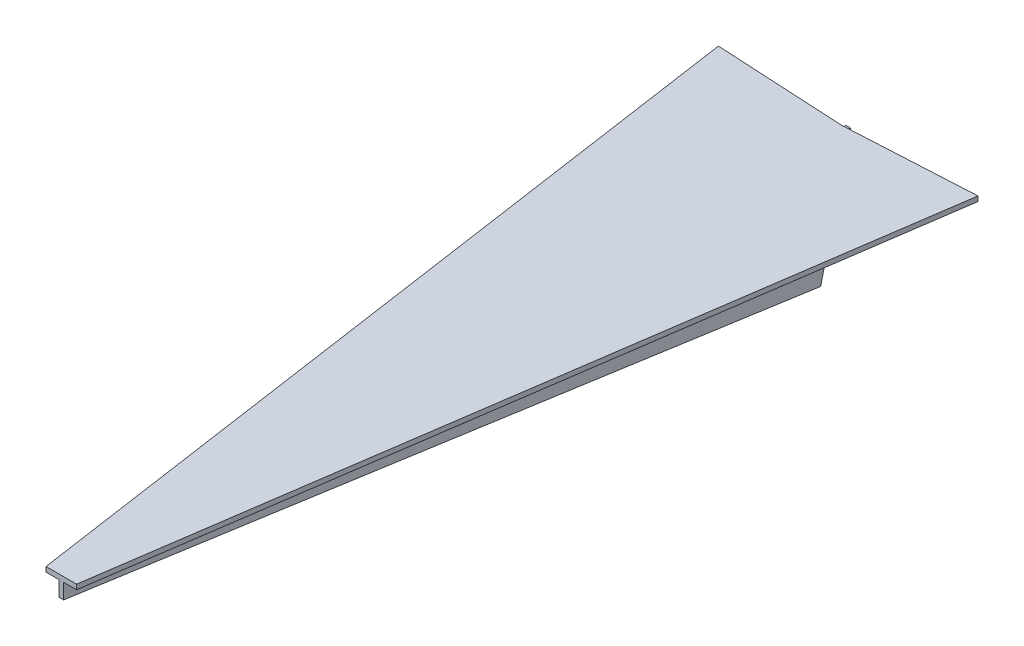
ISO-10303-21;
HEADER;
FILE_DESCRIPTION(('STEP AP214'),'2;1');
FILE_NAME('part.step','',(''),(''),'','','');
FILE_SCHEMA(('AUTOMOTIVE_DESIGN { 1 0 10303 214 1 1 1 1 }'));
ENDSEC;
DATA;
#1=APPLICATION_CONTEXT('core data for automotive mechanical design processes');
#2=APPLICATION_PROTOCOL_DEFINITION('international standard','automotive_design',2000,#1);
#3=PRODUCT_CONTEXT('',#1,'mechanical');
#4=PRODUCT('Part','Part','',(#3));
#5=PRODUCT_RELATED_PRODUCT_CATEGORY('part','',(#4));
#6=PRODUCT_DEFINITION_FORMATION('','',#4);
#7=PRODUCT_DEFINITION_CONTEXT('part definition',#1,'design');
#8=PRODUCT_DEFINITION('design','',#6,#7);
#9=PRODUCT_DEFINITION_SHAPE('','',#8);
#10=(LENGTH_UNIT() NAMED_UNIT(*) SI_UNIT(.MILLI.,.METRE.));
#11=(NAMED_UNIT(*) PLANE_ANGLE_UNIT() SI_UNIT($,.RADIAN.));
#12=(NAMED_UNIT(*) SI_UNIT($,.STERADIAN.) SOLID_ANGLE_UNIT());
#13=UNCERTAINTY_MEASURE_WITH_UNIT(LENGTH_MEASURE(1.E-05),#10,'distance_accuracy_value','');
#14=(GEOMETRIC_REPRESENTATION_CONTEXT(3) GLOBAL_UNCERTAINTY_ASSIGNED_CONTEXT((#13)) GLOBAL_UNIT_ASSIGNED_CONTEXT((#10,
#11,#12)) REPRESENTATION_CONTEXT('',''));
#15=CARTESIAN_POINT('',(0.,0.,0.));
#16=DIRECTION('',(0.,0.,1.));
#17=DIRECTION('',(1.,0.,0.));
#18=AXIS2_PLACEMENT_3D('',#15,#16,#17);
#19=CARTESIAN_POINT('',(0.,0.,0.));
#20=DIRECTION('',(0.,1.,0.));
#21=DIRECTION('',(0.,0.,1.));
#22=AXIS2_PLACEMENT_3D('',#19,#20,#21);
#23=PLANE('',#22);
#24=DIRECTION('',(0.,0.,1.));
#25=VECTOR('',#24,1.);
#26=CARTESIAN_POINT('',(0.75,0.,0.));
#27=LINE('',#26,#25);
#28=CARTESIAN_POINT('',(0.75,0.,-255.040478631689));
#29=VERTEX_POINT('',#28);
#30=CARTESIAN_POINT('',(0.75,0.,0.));
#31=VERTEX_POINT('',#30);
#32=EDGE_CURVE('E44',#29,#31,#27,.T.);
#33=ORIENTED_EDGE('',*,*,#32,.F.);
#34=DIRECTION('',(-0.998546712330058,0.,0.0538930727907848));
#35=VECTOR('',#34,1.);
#36=CARTESIAN_POINT('',(0.,0.,-255.));
#37=LINE('',#36,#35);
#38=CARTESIAN_POINT('',(42.4382352740274,0.,-257.290455593608));
#39=VERTEX_POINT('',#38);
#40=EDGE_CURVE('E158',#39,#29,#37,.T.);
#41=ORIENTED_EDGE('',*,*,#40,.F.);
#42=DIRECTION('',(0.143993212592413,0.,-0.989578675360032));
#43=VECTOR('',#42,1.);
#44=CARTESIAN_POINT('',(42.4382352740274,0.,-257.290455593608));
#45=LINE('',#44,#43);
#46=CARTESIAN_POINT('',(5.,0.,0.));
#47=VERTEX_POINT('',#46);
#48=EDGE_CURVE('E113',#47,#39,#45,.T.);
#49=ORIENTED_EDGE('',*,*,#48,.F.);
#50=DIRECTION('',(1.,0.,0.));
#51=VECTOR('',#50,1.);
#52=CARTESIAN_POINT('',(5.,0.,0.));
#53=LINE('',#52,#51);
#54=EDGE_CURVE('E112',#31,#47,#53,.T.);
#55=ORIENTED_EDGE('',*,*,#54,.F.);
#56=EDGE_LOOP('',(#33,#41,#49,#55));
#57=FACE_BOUND('',#56,.T.);
#58=ADVANCED_FACE('F35',(#57),#23,.F.);
#59=CARTESIAN_POINT('',(0.,1.6,-255.));
#60=DIRECTION('',(-0.0538930727907848,0.,0.998546712330058));
#61=DIRECTION('',(0.998546712330058,0.,0.0538930727907848));
#62=AXIS2_PLACEMENT_3D('',#59,#60,#61);
#63=PLANE('',#62);
#64=DIRECTION('',(-0.998546712330058,0.,-0.0538930727907848));
#65=VECTOR('',#64,1.);
#66=CARTESIAN_POINT('',(0.,0.,-255.));
#67=LINE('',#66,#65);
#68=CARTESIAN_POINT('',(0.,0.,-255.));
#69=VERTEX_POINT('',#68);
#70=CARTESIAN_POINT('',(-0.75,0.,-255.040478631689));
#71=VERTEX_POINT('',#70);
#72=EDGE_CURVE('E167',#69,#71,#67,.T.);
#73=ORIENTED_EDGE('',*,*,#72,.T.);
#74=CARTESIAN_POINT('',(-42.4382352740274,0.,-257.290455593608));
#75=VERTEX_POINT('',#74);
#76=EDGE_CURVE('E153',#71,#75,#67,.T.);
#77=ORIENTED_EDGE('',*,*,#76,.T.);
#78=DIRECTION('',(0.,-1.,0.));
#79=VECTOR('',#78,1.);
#80=CARTESIAN_POINT('',(-42.4382352740274,1.6,-257.290455593608));
#81=LINE('',#80,#79);
#82=CARTESIAN_POINT('',(-42.4382352740274,1.6,-257.290455593608));
#83=VERTEX_POINT('',#82);
#84=EDGE_CURVE('E39',#83,#75,#81,.T.);
#85=ORIENTED_EDGE('',*,*,#84,.F.);
#86=DIRECTION('',(-0.998546712330058,0.,-0.0538930727907848));
#87=VECTOR('',#86,1.);
#88=CARTESIAN_POINT('',(0.,1.6,-255.));
#89=LINE('',#88,#87);
#90=CARTESIAN_POINT('',(0.,1.6,-255.));
#91=VERTEX_POINT('',#90);
#92=EDGE_CURVE('E154',#91,#83,#89,.T.);
#93=ORIENTED_EDGE('',*,*,#92,.F.);
#94=DIRECTION('',(0.,-1.,0.));
#95=VECTOR('',#94,1.);
#96=CARTESIAN_POINT('',(0.,1.6,-255.));
#97=LINE('',#96,#95);
#98=EDGE_CURVE('E166',#91,#69,#97,.T.);
#99=ORIENTED_EDGE('',*,*,#98,.T.);
#100=EDGE_LOOP('',(#73,#77,#85,#93,#99));
#101=FACE_BOUND('',#100,.T.);
#102=ADVANCED_FACE('F37',(#101),#63,.F.);
#103=CARTESIAN_POINT('',(-42.4382352740274,1.6,-257.290455593608));
#104=DIRECTION('',(0.989578675360032,0.,-0.143993212592413));
#105=DIRECTION('',(-0.143993212592413,0.,-0.989578675360032));
#106=AXIS2_PLACEMENT_3D('',#103,#104,#105);
#107=PLANE('',#106);
#108=DIRECTION('',(0.143993212592413,0.,0.989578675360032));
#109=VECTOR('',#108,1.);
#110=CARTESIAN_POINT('',(-42.4382352740274,0.,-257.290455593608));
#111=LINE('',#110,#109);
#112=CARTESIAN_POINT('',(-5.,0.,0.));
#113=VERTEX_POINT('',#112);
#114=EDGE_CURVE('E119',#75,#113,#111,.T.);
#115=ORIENTED_EDGE('',*,*,#114,.T.);
#116=DIRECTION('',(0.,-1.,0.));
#117=VECTOR('',#116,1.);
#118=CARTESIAN_POINT('',(-5.,1.6,0.));
#119=LINE('',#118,#117);
#120=CARTESIAN_POINT('',(-5.,1.6,0.));
#121=VERTEX_POINT('',#120);
#122=EDGE_CURVE('E180',#121,#113,#119,.T.);
#123=ORIENTED_EDGE('',*,*,#122,.F.);
#124=DIRECTION('',(0.143993212592413,0.,0.989578675360032));
#125=VECTOR('',#124,1.);
#126=CARTESIAN_POINT('',(-42.4382352740274,1.6,-257.290455593608));
#127=LINE('',#126,#125);
#128=EDGE_CURVE('E157',#83,#121,#127,.T.);
#129=ORIENTED_EDGE('',*,*,#128,.F.);
#130=ORIENTED_EDGE('',*,*,#84,.T.);
#131=EDGE_LOOP('',(#115,#123,#129,#130));
#132=FACE_BOUND('',#131,.T.);
#133=ADVANCED_FACE('F187',(#132),#107,.F.);
#134=CARTESIAN_POINT('',(5.,1.6,0.));
#135=DIRECTION('',(0.,0.,-1.));
#136=DIRECTION('',(-1.,0.,0.));
#137=AXIS2_PLACEMENT_3D('',#134,#135,#136);
#138=PLANE('',#137);
#139=CARTESIAN_POINT('',(-0.75,0.,0.));
#140=VERTEX_POINT('',#139);
#141=EDGE_CURVE('E118',#113,#140,#53,.T.);
#142=ORIENTED_EDGE('',*,*,#141,.T.);
#143=DIRECTION('',(0.,-1.,0.));
#144=VECTOR('',#143,1.);
#145=CARTESIAN_POINT('',(-0.75,0.,0.));
#146=LINE('',#145,#144);
#147=CARTESIAN_POINT('',(-0.75,-5.,0.));
#148=VERTEX_POINT('',#147);
#149=EDGE_CURVE('E142',#140,#148,#146,.T.);
#150=ORIENTED_EDGE('',*,*,#149,.T.);
#151=DIRECTION('',(-1.,0.,0.));
#152=VECTOR('',#151,1.);
#153=CARTESIAN_POINT('',(0.75,-5.,0.));
#154=LINE('',#153,#152);
#155=CARTESIAN_POINT('',(0.75,-5.,0.));
#156=VERTEX_POINT('',#155);
#157=EDGE_CURVE('E131',#156,#148,#154,.T.);
#158=ORIENTED_EDGE('',*,*,#157,.F.);
#159=DIRECTION('',(0.,-1.,0.));
#160=VECTOR('',#159,1.);
#161=CARTESIAN_POINT('',(0.75,0.,0.));
#162=LINE('',#161,#160);
#163=EDGE_CURVE('E124',#31,#156,#162,.T.);
#164=ORIENTED_EDGE('',*,*,#163,.F.);
#165=ORIENTED_EDGE('',*,*,#54,.T.);
#166=DIRECTION('',(0.,-1.,0.));
#167=VECTOR('',#166,1.);
#168=CARTESIAN_POINT('',(5.,1.6,0.));
#169=LINE('',#168,#167);
#170=CARTESIAN_POINT('',(5.,1.6,0.));
#171=VERTEX_POINT('',#170);
#172=EDGE_CURVE('E179',#171,#47,#169,.T.);
#173=ORIENTED_EDGE('',*,*,#172,.F.);
#174=DIRECTION('',(1.,0.,0.));
#175=VECTOR('',#174,1.);
#176=CARTESIAN_POINT('',(5.,1.6,0.));
#177=LINE('',#176,#175);
#178=EDGE_CURVE('E160',#121,#171,#177,.T.);
#179=ORIENTED_EDGE('',*,*,#178,.F.);
#180=ORIENTED_EDGE('',*,*,#122,.T.);
#181=EDGE_LOOP('',(#142,#150,#158,#164,#165,#173,#179,#180));
#182=FACE_BOUND('',#181,.T.);
#183=ADVANCED_FACE('F129',(#182),#138,.F.);
#184=CARTESIAN_POINT('',(42.4382352740274,1.6,-257.290455593608));
#185=DIRECTION('',(-0.989578675360032,0.,-0.143993212592413));
#186=DIRECTION('',(-0.143993212592413,0.,0.989578675360032));
#187=AXIS2_PLACEMENT_3D('',#184,#185,#186);
#188=PLANE('',#187);
#189=ORIENTED_EDGE('',*,*,#48,.T.);
#190=DIRECTION('',(0.,-1.,0.));
#191=VECTOR('',#190,1.);
#192=CARTESIAN_POINT('',(42.4382352740274,1.6,-257.290455593608));
#193=LINE('',#192,#191);
#194=CARTESIAN_POINT('',(42.4382352740274,1.6,-257.290455593608));
#195=VERTEX_POINT('',#194);
#196=EDGE_CURVE('E176',#195,#39,#193,.T.);
#197=ORIENTED_EDGE('',*,*,#196,.F.);
#198=DIRECTION('',(0.143993212592413,0.,-0.989578675360032));
#199=VECTOR('',#198,1.);
#200=CARTESIAN_POINT('',(42.4382352740274,1.6,-257.290455593608));
#201=LINE('',#200,#199);
#202=EDGE_CURVE('E162',#171,#195,#201,.T.);
#203=ORIENTED_EDGE('',*,*,#202,.F.);
#204=ORIENTED_EDGE('',*,*,#172,.T.);
#205=EDGE_LOOP('',(#189,#197,#203,#204));
#206=FACE_BOUND('',#205,.T.);
#207=ADVANCED_FACE('F216',(#206),#188,.F.);
#208=CARTESIAN_POINT('',(0.,1.6,-255.));
#209=DIRECTION('',(0.0538930727907848,0.,0.998546712330058));
#210=DIRECTION('',(0.998546712330058,0.,-0.0538930727907848));
#211=AXIS2_PLACEMENT_3D('',#208,#209,#210);
#212=PLANE('',#211);
#213=ORIENTED_EDGE('',*,*,#40,.T.);
#214=EDGE_CURVE('E172',#29,#69,#37,.T.);
#215=ORIENTED_EDGE('',*,*,#214,.T.);
#216=ORIENTED_EDGE('',*,*,#98,.F.);
#217=DIRECTION('',(-0.998546712330058,0.,0.0538930727907848));
#218=VECTOR('',#217,1.);
#219=CARTESIAN_POINT('',(0.,1.6,-255.));
#220=LINE('',#219,#218);
#221=EDGE_CURVE('E164',#195,#91,#220,.T.);
#222=ORIENTED_EDGE('',*,*,#221,.F.);
#223=ORIENTED_EDGE('',*,*,#196,.T.);
#224=EDGE_LOOP('',(#213,#215,#216,#222,#223));
#225=FACE_BOUND('',#224,.T.);
#226=ADVANCED_FACE('F211',(#225),#212,.F.);
#227=CARTESIAN_POINT('',(0.,1.6,0.));
#228=DIRECTION('',(0.,1.,0.));
#229=DIRECTION('',(0.,0.,1.));
#230=AXIS2_PLACEMENT_3D('',#227,#228,#229);
#231=PLANE('',#230);
#232=ORIENTED_EDGE('',*,*,#92,.T.);
#233=ORIENTED_EDGE('',*,*,#128,.T.);
#234=ORIENTED_EDGE('',*,*,#178,.T.);
#235=ORIENTED_EDGE('',*,*,#202,.T.);
#236=ORIENTED_EDGE('',*,*,#221,.T.);
#237=EDGE_LOOP('',(#232,#233,#234,#235,#236));
#238=FACE_BOUND('',#237,.T.);
#239=ADVANCED_FACE('F218',(#238),#231,.T.);
#240=ORIENTED_EDGE('',*,*,#76,.F.);
#241=DIRECTION('',(0.,0.,1.));
#242=VECTOR('',#241,1.);
#243=CARTESIAN_POINT('',(-0.75,0.,0.));
#244=LINE('',#243,#242);
#245=EDGE_CURVE('E11',#71,#140,#244,.T.);
#246=ORIENTED_EDGE('',*,*,#245,.T.);
#247=ORIENTED_EDGE('',*,*,#141,.F.);
#248=ORIENTED_EDGE('',*,*,#114,.F.);
#249=EDGE_LOOP('',(#240,#246,#247,#248));
#250=FACE_BOUND('',#249,.T.);
#251=ADVANCED_FACE('F192',(#250),#23,.F.);
#252=CARTESIAN_POINT('',(0.75,0.,0.));
#253=DIRECTION('',(0.,-1.,0.));
#254=DIRECTION('',(0.,0.,-1.));
#255=AXIS2_PLACEMENT_3D('',#252,#253,#254);
#256=PLANE('',#255);
#257=ORIENTED_EDGE('',*,*,#72,.F.);
#258=ORIENTED_EDGE('',*,*,#214,.F.);
#259=CARTESIAN_POINT('',(0.75,0.,-257.290455593608));
#260=VERTEX_POINT('',#259);
#261=EDGE_CURVE('E127',#260,#29,#27,.T.);
#262=ORIENTED_EDGE('',*,*,#261,.F.);
#263=DIRECTION('',(-1.,0.,0.));
#264=VECTOR('',#263,1.);
#265=CARTESIAN_POINT('',(0.75,0.,-257.290455593608));
#266=LINE('',#265,#264);
#267=CARTESIAN_POINT('',(-0.75,0.,-257.290455593608));
#268=VERTEX_POINT('',#267);
#269=EDGE_CURVE('E139',#260,#268,#266,.T.);
#270=ORIENTED_EDGE('',*,*,#269,.T.);
#271=EDGE_CURVE('E46',#268,#71,#244,.T.);
#272=ORIENTED_EDGE('',*,*,#271,.T.);
#273=EDGE_LOOP('',(#257,#258,#262,#270,#272));
#274=FACE_BOUND('',#273,.T.);
#275=ADVANCED_FACE('F208',(#274),#256,.F.);
#276=CARTESIAN_POINT('',(0.75,-5.,0.));
#277=DIRECTION('',(0.,0.990151503558925,-0.14));
#278=DIRECTION('',(0.,0.14,0.990151503558925));
#279=AXIS2_PLACEMENT_3D('',#276,#277,#278);
#280=PLANE('',#279);
#281=DIRECTION('',(0.,-0.14,-0.990151503558925));
#282=VECTOR('',#281,1.);
#283=CARTESIAN_POINT('',(-0.75,-5.,0.));
#284=LINE('',#283,#282);
#285=CARTESIAN_POINT('',(-0.75,-40.,-247.537875889731));
#286=VERTEX_POINT('',#285);
#287=EDGE_CURVE('E144',#148,#286,#284,.T.);
#288=ORIENTED_EDGE('',*,*,#287,.T.);
#289=DIRECTION('',(-1.,0.,0.));
#290=VECTOR('',#289,1.);
#291=CARTESIAN_POINT('',(0.75,-40.,-247.537875889731));
#292=LINE('',#291,#290);
#293=CARTESIAN_POINT('',(0.75,-40.,-247.537875889731));
#294=VERTEX_POINT('',#293);
#295=EDGE_CURVE('E149',#294,#286,#292,.T.);
#296=ORIENTED_EDGE('',*,*,#295,.F.);
#297=DIRECTION('',(0.,-0.14,-0.990151503558925));
#298=VECTOR('',#297,1.);
#299=CARTESIAN_POINT('',(0.75,-5.,0.));
#300=LINE('',#299,#298);
#301=EDGE_CURVE('E133',#156,#294,#300,.T.);
#302=ORIENTED_EDGE('',*,*,#301,.F.);
#303=ORIENTED_EDGE('',*,*,#157,.T.);
#304=EDGE_LOOP('',(#288,#296,#302,#303));
#305=FACE_BOUND('',#304,.T.);
#306=ADVANCED_FACE('F201',(#305),#280,.F.);
#307=CARTESIAN_POINT('',(0.75,-40.,-247.537875889731));
#308=DIRECTION('',(0.,0.236875533401885,0.971540005185362));
#309=DIRECTION('',(0.,-0.971540005185362,0.236875533401885));
#310=AXIS2_PLACEMENT_3D('',#307,#308,#309);
#311=PLANE('',#310);
#312=DIRECTION('',(0.,0.971540005185362,-0.236875533401885));
#313=VECTOR('',#312,1.);
#314=CARTESIAN_POINT('',(-0.75,-40.,-247.537875889731));
#315=LINE('',#314,#313);
#316=EDGE_CURVE('E137',#286,#268,#315,.T.);
#317=ORIENTED_EDGE('',*,*,#316,.T.);
#318=ORIENTED_EDGE('',*,*,#269,.F.);
#319=DIRECTION('',(0.,0.971540005185362,-0.236875533401885));
#320=VECTOR('',#319,1.);
#321=CARTESIAN_POINT('',(0.75,-40.,-247.537875889731));
#322=LINE('',#321,#320);
#323=EDGE_CURVE('E135',#294,#260,#322,.T.);
#324=ORIENTED_EDGE('',*,*,#323,.F.);
#325=ORIENTED_EDGE('',*,*,#295,.T.);
#326=EDGE_LOOP('',(#317,#318,#324,#325));
#327=FACE_BOUND('',#326,.T.);
#328=ADVANCED_FACE('F204',(#327),#311,.F.);
#329=CARTESIAN_POINT('',(0.75,0.,0.));
#330=DIRECTION('',(-1.,0.,0.));
#331=DIRECTION('',(0.,0.,1.));
#332=AXIS2_PLACEMENT_3D('',#329,#330,#331);
#333=PLANE('',#332);
#334=ORIENTED_EDGE('',*,*,#261,.T.);
#335=ORIENTED_EDGE('',*,*,#32,.T.);
#336=ORIENTED_EDGE('',*,*,#163,.T.);
#337=ORIENTED_EDGE('',*,*,#301,.T.);
#338=ORIENTED_EDGE('',*,*,#323,.T.);
#339=EDGE_LOOP('',(#334,#335,#336,#337,#338));
#340=FACE_BOUND('',#339,.T.);
#341=ADVANCED_FACE('F123',(#340),#333,.F.);
#342=CARTESIAN_POINT('',(-0.75,0.,0.));
#343=DIRECTION('',(-1.,0.,0.));
#344=DIRECTION('',(0.,0.,1.));
#345=AXIS2_PLACEMENT_3D('',#342,#343,#344);
#346=PLANE('',#345);
#347=ORIENTED_EDGE('',*,*,#271,.F.);
#348=ORIENTED_EDGE('',*,*,#316,.F.);
#349=ORIENTED_EDGE('',*,*,#287,.F.);
#350=ORIENTED_EDGE('',*,*,#149,.F.);
#351=ORIENTED_EDGE('',*,*,#245,.F.);
#352=EDGE_LOOP('',(#347,#348,#349,#350,#351));
#353=FACE_BOUND('',#352,.T.);
#354=ADVANCED_FACE('F197',(#353),#346,.T.);
#355=CLOSED_SHELL('',(#58,#102,#133,#183,#207,#226,#239,#251,#275,#306,#328,#341,#354));
#356=MANIFOLD_SOLID_BREP('B2',#355);
#357=ADVANCED_BREP_SHAPE_REPRESENTATION('',(#18,#356),#14);
#358=SHAPE_DEFINITION_REPRESENTATION(#9,#357);
ENDSEC;
END-ISO-10303-21;
